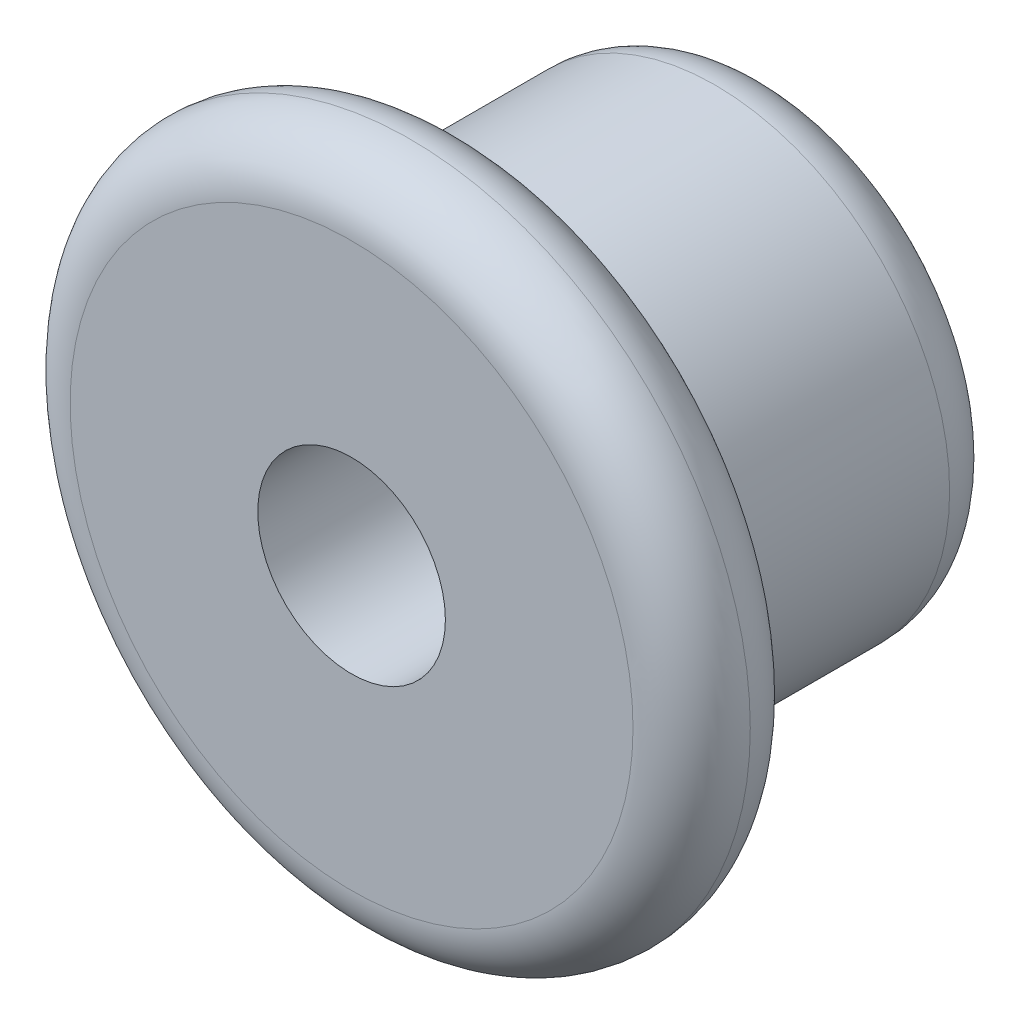
ISO-10303-21;
HEADER;
FILE_DESCRIPTION(('STEP AP214'),'2;1');
FILE_NAME('part.step','',(''),(''),'','','');
FILE_SCHEMA(('AUTOMOTIVE_DESIGN { 1 0 10303 214 1 1 1 1 }'));
ENDSEC;
DATA;
#1=APPLICATION_CONTEXT('core data for automotive mechanical design processes');
#2=APPLICATION_PROTOCOL_DEFINITION('international standard','automotive_design',2000,#1);
#3=PRODUCT_CONTEXT('',#1,'mechanical');
#4=PRODUCT('Part','Part','',(#3));
#5=PRODUCT_RELATED_PRODUCT_CATEGORY('part','',(#4));
#6=PRODUCT_DEFINITION_FORMATION('','',#4);
#7=PRODUCT_DEFINITION_CONTEXT('part definition',#1,'design');
#8=PRODUCT_DEFINITION('design','',#6,#7);
#9=PRODUCT_DEFINITION_SHAPE('','',#8);
#10=(LENGTH_UNIT() NAMED_UNIT(*) SI_UNIT(.MILLI.,.METRE.));
#11=(NAMED_UNIT(*) PLANE_ANGLE_UNIT() SI_UNIT($,.RADIAN.));
#12=(NAMED_UNIT(*) SI_UNIT($,.STERADIAN.) SOLID_ANGLE_UNIT());
#13=UNCERTAINTY_MEASURE_WITH_UNIT(LENGTH_MEASURE(1.E-05),#10,'distance_accuracy_value','');
#14=(GEOMETRIC_REPRESENTATION_CONTEXT(3) GLOBAL_UNCERTAINTY_ASSIGNED_CONTEXT((#13)) GLOBAL_UNIT_ASSIGNED_CONTEXT((#10,
#11,#12)) REPRESENTATION_CONTEXT('',''));
#15=CARTESIAN_POINT('',(0.,0.,0.));
#16=DIRECTION('',(0.,0.,1.));
#17=DIRECTION('',(1.,0.,0.));
#18=AXIS2_PLACEMENT_3D('',#15,#16,#17);
#19=CARTESIAN_POINT('',(0.,0.,2.6));
#20=DIRECTION('',(0.,0.,-1.));
#21=DIRECTION('',(-1.,0.,0.));
#22=AXIS2_PLACEMENT_3D('',#19,#20,#21);
#23=CYLINDRICAL_SURFACE('',#22,2.);
#24=CARTESIAN_POINT('',(0.,0.,0.5));
#25=DIRECTION('',(0.,0.,1.));
#26=DIRECTION('',(1.,0.,0.));
#27=AXIS2_PLACEMENT_3D('',#24,#25,#26);
#28=CIRCLE('',#27,2.);
#29=CARTESIAN_POINT('',(2.,0.,0.5));
#30=VERTEX_POINT('',#29);
#31=EDGE_CURVE('E109',#30,#30,#28,.T.);
#32=ORIENTED_EDGE('',*,*,#31,.T.);
#33=EDGE_LOOP('',(#32));
#34=FACE_BOUND('',#33,.T.);
#35=CARTESIAN_POINT('',(0.,0.,2.6));
#36=DIRECTION('',(0.,0.,1.));
#37=DIRECTION('',(1.,0.,0.));
#38=AXIS2_PLACEMENT_3D('',#35,#36,#37);
#39=CIRCLE('',#38,2.);
#40=CARTESIAN_POINT('',(2.,0.,2.6));
#41=VERTEX_POINT('',#40);
#42=EDGE_CURVE('E112',#41,#41,#39,.T.);
#43=ORIENTED_EDGE('',*,*,#42,.F.);
#44=EDGE_LOOP('',(#43));
#45=FACE_BOUND('',#44,.T.);
#46=ADVANCED_FACE('F92',(#34,#45),#23,.T.);
#47=CARTESIAN_POINT('',(0.,0.,0.));
#48=DIRECTION('',(0.,0.,1.));
#49=DIRECTION('',(1.,0.,0.));
#50=AXIS2_PLACEMENT_3D('',#47,#48,#49);
#51=PLANE('',#50);
#52=CARTESIAN_POINT('',(0.,0.,0.));
#53=DIRECTION('',(0.,0.,1.));
#54=DIRECTION('',(1.,0.,0.));
#55=AXIS2_PLACEMENT_3D('',#52,#53,#54);
#56=CIRCLE('',#55,1.5);
#57=CARTESIAN_POINT('',(1.5,0.,0.));
#58=VERTEX_POINT('',#57);
#59=EDGE_CURVE('E104',#58,#58,#56,.F.);
#60=ORIENTED_EDGE('',*,*,#59,.T.);
#61=EDGE_LOOP('',(#60));
#62=FACE_BOUND('',#61,.T.);
#63=CARTESIAN_POINT('',(0.,0.,0.));
#64=DIRECTION('',(0.,0.,1.));
#65=DIRECTION('',(1.,0.,0.));
#66=AXIS2_PLACEMENT_3D('',#63,#64,#65);
#67=CIRCLE('',#66,0.8);
#68=CARTESIAN_POINT('',(0.8,0.,0.));
#69=VERTEX_POINT('',#68);
#70=EDGE_CURVE('E116',#69,#69,#67,.T.);
#71=ORIENTED_EDGE('',*,*,#70,.T.);
#72=EDGE_LOOP('',(#71));
#73=FACE_BOUND('',#72,.T.);
#74=ADVANCED_FACE('F139',(#62,#73),#51,.F.);
#75=CARTESIAN_POINT('',(0.,0.,3.6));
#76=DIRECTION('',(0.,0.,1.));
#77=DIRECTION('',(1.,0.,0.));
#78=AXIS2_PLACEMENT_3D('',#75,#76,#77);
#79=PLANE('',#78);
#80=CARTESIAN_POINT('',(0.,0.,3.6));
#81=DIRECTION('',(0.,0.,1.));
#82=DIRECTION('',(1.,0.,0.));
#83=AXIS2_PLACEMENT_3D('',#80,#81,#82);
#84=CIRCLE('',#83,2.4);
#85=CARTESIAN_POINT('',(2.4,0.,3.6));
#86=VERTEX_POINT('',#85);
#87=EDGE_CURVE('E11',#86,#86,#84,.T.);
#88=ORIENTED_EDGE('',*,*,#87,.T.);
#89=EDGE_LOOP('',(#88));
#90=FACE_BOUND('',#89,.T.);
#91=CARTESIAN_POINT('',(0.,0.,3.6));
#92=DIRECTION('',(0.,0.,1.));
#93=DIRECTION('',(1.,0.,0.));
#94=AXIS2_PLACEMENT_3D('',#91,#92,#93);
#95=CIRCLE('',#94,0.8);
#96=CARTESIAN_POINT('',(0.8,0.,3.6));
#97=VERTEX_POINT('',#96);
#98=EDGE_CURVE('E113',#97,#97,#95,.T.);
#99=ORIENTED_EDGE('',*,*,#98,.F.);
#100=EDGE_LOOP('',(#99));
#101=FACE_BOUND('',#100,.T.);
#102=ADVANCED_FACE('F145',(#90,#101),#79,.T.);
#103=CARTESIAN_POINT('',(0.,0.,2.6));
#104=DIRECTION('',(0.,0.,1.));
#105=DIRECTION('',(1.,0.,0.));
#106=AXIS2_PLACEMENT_3D('',#103,#104,#105);
#107=PLANE('',#106);
#108=CARTESIAN_POINT('',(0.,0.,2.6));
#109=DIRECTION('',(0.,0.,1.));
#110=DIRECTION('',(1.,0.,0.));
#111=AXIS2_PLACEMENT_3D('',#108,#109,#110);
#112=CIRCLE('',#111,2.4);
#113=CARTESIAN_POINT('',(2.4,0.,2.6));
#114=VERTEX_POINT('',#113);
#115=EDGE_CURVE('E100',#114,#114,#112,.F.);
#116=ORIENTED_EDGE('',*,*,#115,.T.);
#117=EDGE_LOOP('',(#116));
#118=FACE_BOUND('',#117,.T.);
#119=ORIENTED_EDGE('',*,*,#42,.T.);
#120=EDGE_LOOP('',(#119));
#121=FACE_BOUND('',#120,.T.);
#122=ADVANCED_FACE('F150',(#118,#121),#107,.F.);
#123=CARTESIAN_POINT('',(0.,0.,0.));
#124=DIRECTION('',(0.,0.,1.));
#125=DIRECTION('',(1.,0.,0.));
#126=AXIS2_PLACEMENT_3D('',#123,#124,#125);
#127=CYLINDRICAL_SURFACE('',#126,0.8);
#128=ORIENTED_EDGE('',*,*,#98,.T.);
#129=EDGE_LOOP('',(#128));
#130=FACE_BOUND('',#129,.T.);
#131=ORIENTED_EDGE('',*,*,#70,.F.);
#132=EDGE_LOOP('',(#131));
#133=FACE_BOUND('',#132,.T.);
#134=ADVANCED_FACE('F135',(#130,#133),#127,.F.);
#135=CARTESIAN_POINT('',(0.,0.,0.5));
#136=DIRECTION('',(0.,0.,1.));
#137=DIRECTION('',(1.,0.,0.));
#138=AXIS2_PLACEMENT_3D('',#135,#136,#137);
#139=TOROIDAL_SURFACE('',#138,1.5,0.5);
#140=ORIENTED_EDGE('',*,*,#59,.F.);
#141=EDGE_LOOP('',(#140));
#142=FACE_BOUND('',#141,.T.);
#143=ORIENTED_EDGE('',*,*,#31,.F.);
#144=EDGE_LOOP('',(#143));
#145=FACE_BOUND('',#144,.T.);
#146=ADVANCED_FACE('F128',(#142,#145),#139,.T.);
#147=CARTESIAN_POINT('',(0.,0.,3.1));
#148=DIRECTION('',(0.,0.,1.));
#149=DIRECTION('',(1.,0.,0.));
#150=AXIS2_PLACEMENT_3D('',#147,#148,#149);
#151=TOROIDAL_SURFACE('',#150,2.4,0.5);
#152=ORIENTED_EDGE('',*,*,#87,.F.);
#153=EDGE_LOOP('',(#152));
#154=FACE_BOUND('',#153,.T.);
#155=CARTESIAN_POINT('',(0.,0.,3.1));
#156=DIRECTION('',(0.,0.,1.));
#157=DIRECTION('',(1.,0.,0.));
#158=AXIS2_PLACEMENT_3D('',#155,#156,#157);
#159=CIRCLE('',#158,2.9);
#160=CARTESIAN_POINT('',(2.9,0.,3.1));
#161=VERTEX_POINT('',#160);
#162=EDGE_CURVE('E96',#161,#161,#159,.F.);
#163=ORIENTED_EDGE('',*,*,#162,.F.);
#164=EDGE_LOOP('',(#163));
#165=FACE_BOUND('',#164,.T.);
#166=ADVANCED_FACE('F94',(#154,#165),#151,.T.);
#167=CARTESIAN_POINT('',(0.,0.,3.1));
#168=DIRECTION('',(0.,0.,1.));
#169=DIRECTION('',(1.,0.,0.));
#170=AXIS2_PLACEMENT_3D('',#167,#168,#169);
#171=TOROIDAL_SURFACE('',#170,2.4,0.5);
#172=ORIENTED_EDGE('',*,*,#115,.F.);
#173=EDGE_LOOP('',(#172));
#174=FACE_BOUND('',#173,.T.);
#175=ORIENTED_EDGE('',*,*,#162,.T.);
#176=EDGE_LOOP('',(#175));
#177=FACE_BOUND('',#176,.T.);
#178=ADVANCED_FACE('F125',(#174,#177),#171,.T.);
#179=CLOSED_SHELL('',(#46,#74,#102,#122,#134,#146,#166,#178));
#180=MANIFOLD_SOLID_BREP('B2',#179);
#181=ADVANCED_BREP_SHAPE_REPRESENTATION('',(#18,#180),#14);
#182=SHAPE_DEFINITION_REPRESENTATION(#9,#181);
ENDSEC;
END-ISO-10303-21;
